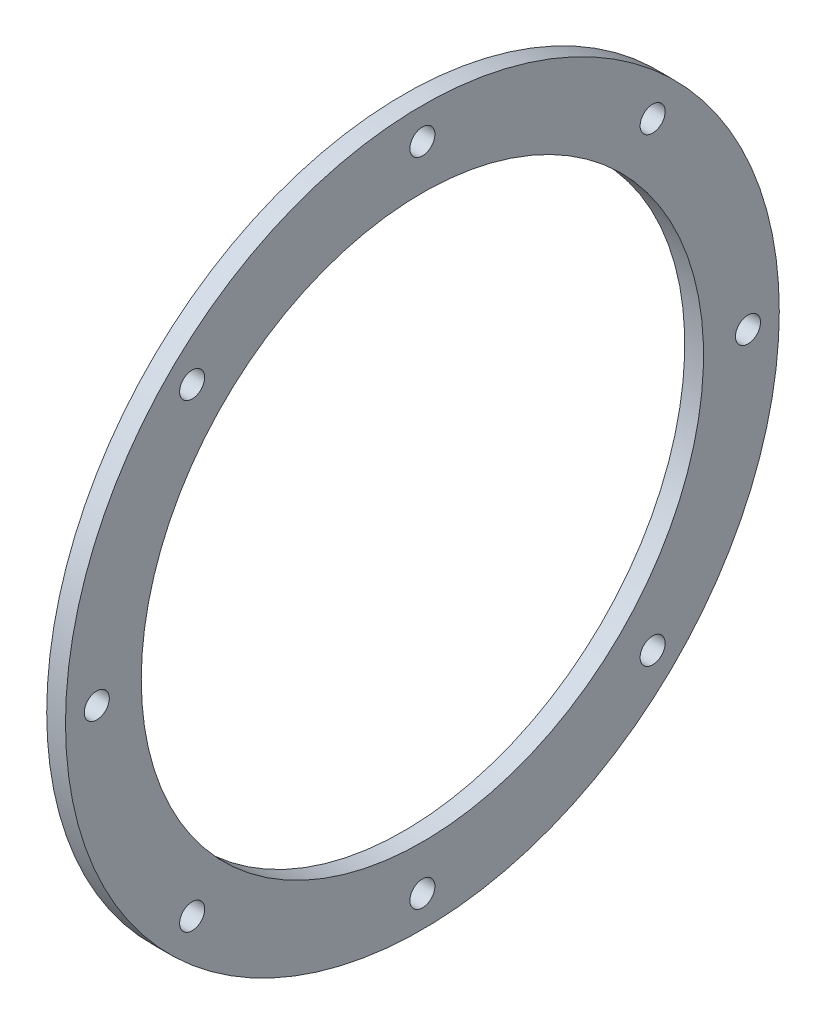
ISO-10303-21;
HEADER;
FILE_DESCRIPTION(('STEP AP214'),'2;1');
FILE_NAME('part.step','',(''),(''),'','','');
FILE_SCHEMA(('AUTOMOTIVE_DESIGN { 1 0 10303 214 1 1 1 1 }'));
ENDSEC;
DATA;
#1=APPLICATION_CONTEXT('core data for automotive mechanical design processes');
#2=APPLICATION_PROTOCOL_DEFINITION('international standard','automotive_design',2000,#1);
#3=PRODUCT_CONTEXT('',#1,'mechanical');
#4=PRODUCT('Part','Part','',(#3));
#5=PRODUCT_RELATED_PRODUCT_CATEGORY('part','',(#4));
#6=PRODUCT_DEFINITION_FORMATION('','',#4);
#7=PRODUCT_DEFINITION_CONTEXT('part definition',#1,'design');
#8=PRODUCT_DEFINITION('design','',#6,#7);
#9=PRODUCT_DEFINITION_SHAPE('','',#8);
#10=(LENGTH_UNIT() NAMED_UNIT(*) SI_UNIT(.MILLI.,.METRE.));
#11=(NAMED_UNIT(*) PLANE_ANGLE_UNIT() SI_UNIT($,.RADIAN.));
#12=(NAMED_UNIT(*) SI_UNIT($,.STERADIAN.) SOLID_ANGLE_UNIT());
#13=UNCERTAINTY_MEASURE_WITH_UNIT(LENGTH_MEASURE(1.E-05),#10,'distance_accuracy_value','');
#14=(GEOMETRIC_REPRESENTATION_CONTEXT(3) GLOBAL_UNCERTAINTY_ASSIGNED_CONTEXT((#13)) GLOBAL_UNIT_ASSIGNED_CONTEXT((#10,
#11,#12)) REPRESENTATION_CONTEXT('',''));
#15=CARTESIAN_POINT('',(0.,0.,0.));
#16=DIRECTION('',(0.,0.,1.));
#17=DIRECTION('',(1.,0.,0.));
#18=AXIS2_PLACEMENT_3D('',#15,#16,#17);
#19=CARTESIAN_POINT('',(12.2498384295794,0.,0.));
#20=DIRECTION('',(1.,0.,0.));
#21=DIRECTION('',(0.,0.,-1.));
#22=AXIS2_PLACEMENT_3D('',#19,#20,#21);
#23=PLANE('',#22);
#24=CARTESIAN_POINT('',(12.2498384295794,-1.81557029619843E-13,-52.));
#25=DIRECTION('',(1.,0.,0.));
#26=DIRECTION('',(0.,-1.,0.));
#27=AXIS2_PLACEMENT_3D('',#24,#25,#26);
#28=CIRCLE('',#27,2.);
#29=CARTESIAN_POINT('',(12.2498384295794,-2.00000000000019,-52.));
#30=VERTEX_POINT('',#29);
#31=EDGE_CURVE('E86',#30,#30,#28,.T.);
#32=ORIENTED_EDGE('',*,*,#31,.F.);
#33=EDGE_LOOP('',(#32));
#34=FACE_BOUND('',#33,.T.);
#35=CARTESIAN_POINT('',(12.2498384295794,-36.7695526217007,-36.7695526217003));
#36=DIRECTION('',(1.,0.,0.));
#37=DIRECTION('',(0.,-0.707106781186544,0.707106781186551));
#38=AXIS2_PLACEMENT_3D('',#35,#36,#37);
#39=CIRCLE('',#38,2.);
#40=CARTESIAN_POINT('',(12.2498384295794,-38.1837661840737,-35.3553390593272));
#41=VERTEX_POINT('',#40);
#42=EDGE_CURVE('E80',#41,#41,#39,.T.);
#43=ORIENTED_EDGE('',*,*,#42,.F.);
#44=EDGE_LOOP('',(#43));
#45=FACE_BOUND('',#44,.T.);
#46=CARTESIAN_POINT('',(12.2498384295794,-52.,0.));
#47=DIRECTION('',(1.,0.,0.));
#48=DIRECTION('',(0.,0.,1.));
#49=AXIS2_PLACEMENT_3D('',#46,#47,#48);
#50=CIRCLE('',#49,2.);
#51=CARTESIAN_POINT('',(12.2498384295794,-52.,2.));
#52=VERTEX_POINT('',#51);
#53=EDGE_CURVE('E72',#52,#52,#50,.T.);
#54=ORIENTED_EDGE('',*,*,#53,.F.);
#55=EDGE_LOOP('',(#54));
#56=FACE_BOUND('',#55,.T.);
#57=CARTESIAN_POINT('',(12.2498384295794,-36.7695526217002,36.7695526217008));
#58=DIRECTION('',(1.,0.,0.));
#59=DIRECTION('',(0.,0.707106781186554,0.707106781186541));
#60=AXIS2_PLACEMENT_3D('',#57,#58,#59);
#61=CIRCLE('',#60,2.);
#62=CARTESIAN_POINT('',(12.2498384295794,-35.355339059327,38.1837661840739));
#63=VERTEX_POINT('',#62);
#64=EDGE_CURVE('E73',#63,#63,#61,.T.);
#65=ORIENTED_EDGE('',*,*,#64,.F.);
#66=EDGE_LOOP('',(#65));
#67=FACE_BOUND('',#66,.T.);
#68=CARTESIAN_POINT('',(12.2498384295794,5.44671088859529E-13,52.));
#69=DIRECTION('',(1.,0.,0.));
#70=DIRECTION('',(0.,1.,0.));
#71=AXIS2_PLACEMENT_3D('',#68,#69,#70);
#72=CIRCLE('',#71,2.);
#73=CARTESIAN_POINT('',(12.2498384295794,2.00000000000055,52.));
#74=VERTEX_POINT('',#73);
#75=EDGE_CURVE('E96',#74,#74,#72,.T.);
#76=ORIENTED_EDGE('',*,*,#75,.F.);
#77=EDGE_LOOP('',(#76));
#78=FACE_BOUND('',#77,.T.);
#79=CARTESIAN_POINT('',(12.2498384295794,36.7695526217009,36.7695526217));
#80=DIRECTION('',(1.,0.,0.));
#81=DIRECTION('',(0.,0.707106781186539,-0.707106781186556));
#82=AXIS2_PLACEMENT_3D('',#79,#80,#81);
#83=CIRCLE('',#82,2.);
#84=CARTESIAN_POINT('',(12.2498384295794,38.183766184074,35.3553390593269));
#85=VERTEX_POINT('',#84);
#86=EDGE_CURVE('E97',#85,#85,#83,.T.);
#87=ORIENTED_EDGE('',*,*,#86,.F.);
#88=EDGE_LOOP('',(#87));
#89=FACE_BOUND('',#88,.T.);
#90=CARTESIAN_POINT('',(12.2498384295794,36.7695526217004,-36.7695526217005));
#91=DIRECTION('',(1.,0.,0.));
#92=DIRECTION('',(0.,-0.707106781186549,-0.707106781186546));
#93=AXIS2_PLACEMENT_3D('',#90,#91,#92);
#94=CIRCLE('',#93,2.);
#95=CARTESIAN_POINT('',(12.2498384295794,35.3553390593273,-38.1837661840736));
#96=VERTEX_POINT('',#95);
#97=EDGE_CURVE('E65',#96,#96,#94,.T.);
#98=ORIENTED_EDGE('',*,*,#97,.F.);
#99=EDGE_LOOP('',(#98));
#100=FACE_BOUND('',#99,.T.);
#101=CARTESIAN_POINT('',(12.2498384295794,52.,0.));
#102=DIRECTION('',(1.,0.,0.));
#103=DIRECTION('',(0.,0.,-1.));
#104=AXIS2_PLACEMENT_3D('',#101,#102,#103);
#105=CIRCLE('',#104,2.);
#106=CARTESIAN_POINT('',(12.2498384295794,52.,-2.));
#107=VERTEX_POINT('',#106);
#108=EDGE_CURVE('E56',#107,#107,#105,.T.);
#109=ORIENTED_EDGE('',*,*,#108,.F.);
#110=EDGE_LOOP('',(#109));
#111=FACE_BOUND('',#110,.T.);
#112=CARTESIAN_POINT('',(12.2498384295793,0.,0.));
#113=DIRECTION('',(-1.,0.,0.));
#114=DIRECTION('',(0.,0.,1.));
#115=AXIS2_PLACEMENT_3D('',#112,#113,#114);
#116=CIRCLE('',#115,44.9);
#117=CARTESIAN_POINT('',(12.2498384295793,0.,44.9));
#118=VERTEX_POINT('',#117);
#119=EDGE_CURVE('E51',#118,#118,#116,.T.);
#120=ORIENTED_EDGE('',*,*,#119,.T.);
#121=EDGE_LOOP('',(#120));
#122=FACE_BOUND('',#121,.T.);
#123=CARTESIAN_POINT('',(12.2498384295793,0.,0.));
#124=DIRECTION('',(-1.,0.,0.));
#125=DIRECTION('',(0.,0.,1.));
#126=AXIS2_PLACEMENT_3D('',#123,#124,#125);
#127=CIRCLE('',#126,57.);
#128=CARTESIAN_POINT('',(12.2498384295793,0.,57.));
#129=VERTEX_POINT('',#128);
#130=EDGE_CURVE('E10',#129,#129,#127,.T.);
#131=ORIENTED_EDGE('',*,*,#130,.F.);
#132=EDGE_LOOP('',(#131));
#133=FACE_BOUND('',#132,.T.);
#134=ADVANCED_FACE('F37',(#34,#45,#56,#67,#78,#89,#100,#111,#122,#133),#23,.T.);
#135=CARTESIAN_POINT('',(-478.111946856672,0.,0.));
#136=DIRECTION('',(-1.,0.,0.));
#137=DIRECTION('',(0.,0.,1.));
#138=AXIS2_PLACEMENT_3D('',#135,#136,#137);
#139=CYLINDRICAL_SURFACE('',#138,57.);
#140=ORIENTED_EDGE('',*,*,#130,.T.);
#141=EDGE_LOOP('',(#140));
#142=FACE_BOUND('',#141,.T.);
#143=CARTESIAN_POINT('',(9.24983842957933,0.,0.));
#144=DIRECTION('',(-1.,0.,0.));
#145=DIRECTION('',(0.,0.,1.));
#146=AXIS2_PLACEMENT_3D('',#143,#144,#145);
#147=CIRCLE('',#146,57.);
#148=CARTESIAN_POINT('',(9.24983842957933,0.,57.));
#149=VERTEX_POINT('',#148);
#150=EDGE_CURVE('E43',#149,#149,#147,.T.);
#151=ORIENTED_EDGE('',*,*,#150,.F.);
#152=EDGE_LOOP('',(#151));
#153=FACE_BOUND('',#152,.T.);
#154=ADVANCED_FACE('F110',(#142,#153),#139,.T.);
#155=CARTESIAN_POINT('',(9.24983842957935,0.,0.));
#156=DIRECTION('',(1.,0.,0.));
#157=DIRECTION('',(0.,0.,-1.));
#158=AXIS2_PLACEMENT_3D('',#155,#156,#157);
#159=PLANE('',#158);
#160=CARTESIAN_POINT('',(9.24983842957935,-1.81557029619843E-13,-52.));
#161=DIRECTION('',(-1.,0.,0.));
#162=DIRECTION('',(0.,1.,0.));
#163=AXIS2_PLACEMENT_3D('',#160,#161,#162);
#164=CIRCLE('',#163,2.);
#165=CARTESIAN_POINT('',(9.24983842957935,1.99999999999982,-52.));
#166=VERTEX_POINT('',#165);
#167=EDGE_CURVE('E68',#166,#166,#164,.T.);
#168=ORIENTED_EDGE('',*,*,#167,.F.);
#169=EDGE_LOOP('',(#168));
#170=FACE_BOUND('',#169,.T.);
#171=CARTESIAN_POINT('',(9.24983842957935,-36.7695526217007,-36.7695526217003));
#172=DIRECTION('',(-1.,0.,0.));
#173=DIRECTION('',(0.,0.707106781186544,-0.707106781186551));
#174=AXIS2_PLACEMENT_3D('',#171,#172,#173);
#175=CIRCLE('',#174,2.);
#176=CARTESIAN_POINT('',(9.24983842957935,-35.3553390593276,-38.1837661840734));
#177=VERTEX_POINT('',#176);
#178=EDGE_CURVE('E83',#177,#177,#175,.T.);
#179=ORIENTED_EDGE('',*,*,#178,.F.);
#180=EDGE_LOOP('',(#179));
#181=FACE_BOUND('',#180,.T.);
#182=CARTESIAN_POINT('',(9.24983842957935,-52.,0.));
#183=DIRECTION('',(-1.,0.,0.));
#184=DIRECTION('',(0.,0.,-1.));
#185=AXIS2_PLACEMENT_3D('',#182,#183,#184);
#186=CIRCLE('',#185,2.);
#187=CARTESIAN_POINT('',(9.24983842957935,-52.,-2.));
#188=VERTEX_POINT('',#187);
#189=EDGE_CURVE('E77',#188,#188,#186,.T.);
#190=ORIENTED_EDGE('',*,*,#189,.F.);
#191=EDGE_LOOP('',(#190));
#192=FACE_BOUND('',#191,.T.);
#193=CARTESIAN_POINT('',(9.24983842957935,-36.7695526217002,36.7695526217008));
#194=DIRECTION('',(-1.,0.,0.));
#195=DIRECTION('',(0.,-0.707106781186554,-0.707106781186541));
#196=AXIS2_PLACEMENT_3D('',#193,#194,#195);
#197=CIRCLE('',#196,2.);
#198=CARTESIAN_POINT('',(9.24983842957935,-38.1837661840733,35.3553390593277));
#199=VERTEX_POINT('',#198);
#200=EDGE_CURVE('E69',#199,#199,#197,.T.);
#201=ORIENTED_EDGE('',*,*,#200,.F.);
#202=EDGE_LOOP('',(#201));
#203=FACE_BOUND('',#202,.T.);
#204=CARTESIAN_POINT('',(9.24983842957935,5.44671088859529E-13,52.));
#205=DIRECTION('',(-1.,0.,0.));
#206=DIRECTION('',(0.,-1.,0.));
#207=AXIS2_PLACEMENT_3D('',#204,#205,#206);
#208=CIRCLE('',#207,2.);
#209=CARTESIAN_POINT('',(9.24983842957935,-1.99999999999946,52.));
#210=VERTEX_POINT('',#209);
#211=EDGE_CURVE('E76',#210,#210,#208,.T.);
#212=ORIENTED_EDGE('',*,*,#211,.F.);
#213=EDGE_LOOP('',(#212));
#214=FACE_BOUND('',#213,.T.);
#215=CARTESIAN_POINT('',(9.24983842957935,36.7695526217009,36.7695526217));
#216=DIRECTION('',(-1.,0.,0.));
#217=DIRECTION('',(0.,-0.707106781186539,0.707106781186556));
#218=AXIS2_PLACEMENT_3D('',#215,#216,#217);
#219=CIRCLE('',#218,2.);
#220=CARTESIAN_POINT('',(9.24983842957935,35.3553390593278,38.1837661840731));
#221=VERTEX_POINT('',#220);
#222=EDGE_CURVE('E93',#221,#221,#219,.T.);
#223=ORIENTED_EDGE('',*,*,#222,.F.);
#224=EDGE_LOOP('',(#223));
#225=FACE_BOUND('',#224,.T.);
#226=CARTESIAN_POINT('',(9.24983842957935,36.7695526217004,-36.7695526217005));
#227=DIRECTION('',(-1.,0.,0.));
#228=DIRECTION('',(0.,0.707106781186549,0.707106781186546));
#229=AXIS2_PLACEMENT_3D('',#226,#227,#228);
#230=CIRCLE('',#229,2.);
#231=CARTESIAN_POINT('',(9.24983842957935,38.1837661840735,-35.3553390593274));
#232=VERTEX_POINT('',#231);
#233=EDGE_CURVE('E62',#232,#232,#230,.T.);
#234=ORIENTED_EDGE('',*,*,#233,.F.);
#235=EDGE_LOOP('',(#234));
#236=FACE_BOUND('',#235,.T.);
#237=CARTESIAN_POINT('',(9.24983842957935,52.,0.));
#238=DIRECTION('',(-1.,0.,0.));
#239=DIRECTION('',(0.,0.,1.));
#240=AXIS2_PLACEMENT_3D('',#237,#238,#239);
#241=CIRCLE('',#240,2.);
#242=CARTESIAN_POINT('',(9.24983842957935,52.,2.));
#243=VERTEX_POINT('',#242);
#244=EDGE_CURVE('E59',#243,#243,#241,.T.);
#245=ORIENTED_EDGE('',*,*,#244,.F.);
#246=EDGE_LOOP('',(#245));
#247=FACE_BOUND('',#246,.T.);
#248=CARTESIAN_POINT('',(9.24983842957933,0.,0.));
#249=DIRECTION('',(-1.,0.,0.));
#250=DIRECTION('',(0.,0.,1.));
#251=AXIS2_PLACEMENT_3D('',#248,#249,#250);
#252=CIRCLE('',#251,44.9);
#253=CARTESIAN_POINT('',(9.24983842957933,0.,44.9));
#254=VERTEX_POINT('',#253);
#255=EDGE_CURVE('E47',#254,#254,#252,.T.);
#256=ORIENTED_EDGE('',*,*,#255,.F.);
#257=EDGE_LOOP('',(#256));
#258=FACE_BOUND('',#257,.T.);
#259=ORIENTED_EDGE('',*,*,#150,.T.);
#260=EDGE_LOOP('',(#259));
#261=FACE_BOUND('',#260,.T.);
#262=ADVANCED_FACE('F125',(#170,#181,#192,#203,#214,#225,#236,#247,#258,#261),#159,.F.);
#263=CARTESIAN_POINT('',(-478.111946856672,0.,0.));
#264=DIRECTION('',(-1.,0.,0.));
#265=DIRECTION('',(0.,0.,1.));
#266=AXIS2_PLACEMENT_3D('',#263,#264,#265);
#267=CYLINDRICAL_SURFACE('',#266,44.9);
#268=ORIENTED_EDGE('',*,*,#119,.F.);
#269=EDGE_LOOP('',(#268));
#270=FACE_BOUND('',#269,.T.);
#271=ORIENTED_EDGE('',*,*,#255,.T.);
#272=EDGE_LOOP('',(#271));
#273=FACE_BOUND('',#272,.T.);
#274=ADVANCED_FACE('F121',(#270,#273),#267,.F.);
#275=CARTESIAN_POINT('',(19.2498384295794,52.,0.));
#276=DIRECTION('',(-1.,0.,0.));
#277=DIRECTION('',(0.,0.,1.));
#278=AXIS2_PLACEMENT_3D('',#275,#276,#277);
#279=CYLINDRICAL_SURFACE('',#278,2.);
#280=ORIENTED_EDGE('',*,*,#108,.T.);
#281=EDGE_LOOP('',(#280));
#282=FACE_BOUND('',#281,.T.);
#283=ORIENTED_EDGE('',*,*,#244,.T.);
#284=EDGE_LOOP('',(#283));
#285=FACE_BOUND('',#284,.T.);
#286=ADVANCED_FACE('F124',(#282,#285),#279,.F.);
#287=CARTESIAN_POINT('',(19.2498384295794,36.7695526217004,-36.7695526217005));
#288=DIRECTION('',(-1.,0.,0.));
#289=DIRECTION('',(0.,0.707106781186549,0.707106781186546));
#290=AXIS2_PLACEMENT_3D('',#287,#288,#289);
#291=CYLINDRICAL_SURFACE('',#290,2.);
#292=ORIENTED_EDGE('',*,*,#97,.T.);
#293=EDGE_LOOP('',(#292));
#294=FACE_BOUND('',#293,.T.);
#295=ORIENTED_EDGE('',*,*,#233,.T.);
#296=EDGE_LOOP('',(#295));
#297=FACE_BOUND('',#296,.T.);
#298=ADVANCED_FACE('F140',(#294,#297),#291,.F.);
#299=CARTESIAN_POINT('',(19.2498384295794,36.7695526217009,36.7695526217));
#300=DIRECTION('',(-1.,0.,0.));
#301=DIRECTION('',(0.,-0.707106781186539,0.707106781186556));
#302=AXIS2_PLACEMENT_3D('',#299,#300,#301);
#303=CYLINDRICAL_SURFACE('',#302,2.);
#304=ORIENTED_EDGE('',*,*,#86,.T.);
#305=EDGE_LOOP('',(#304));
#306=FACE_BOUND('',#305,.T.);
#307=ORIENTED_EDGE('',*,*,#222,.T.);
#308=EDGE_LOOP('',(#307));
#309=FACE_BOUND('',#308,.T.);
#310=ADVANCED_FACE('F144',(#306,#309),#303,.F.);
#311=CARTESIAN_POINT('',(19.2498384295794,5.44671088859529E-13,52.));
#312=DIRECTION('',(-1.,0.,0.));
#313=DIRECTION('',(0.,-1.,0.));
#314=AXIS2_PLACEMENT_3D('',#311,#312,#313);
#315=CYLINDRICAL_SURFACE('',#314,2.);
#316=ORIENTED_EDGE('',*,*,#75,.T.);
#317=EDGE_LOOP('',(#316));
#318=FACE_BOUND('',#317,.T.);
#319=ORIENTED_EDGE('',*,*,#211,.T.);
#320=EDGE_LOOP('',(#319));
#321=FACE_BOUND('',#320,.T.);
#322=ADVANCED_FACE('F105',(#318,#321),#315,.F.);
#323=CARTESIAN_POINT('',(19.2498384295794,-36.7695526217002,36.7695526217008));
#324=DIRECTION('',(-1.,0.,0.));
#325=DIRECTION('',(0.,-0.707106781186554,-0.707106781186541));
#326=AXIS2_PLACEMENT_3D('',#323,#324,#325);
#327=CYLINDRICAL_SURFACE('',#326,2.);
#328=ORIENTED_EDGE('',*,*,#64,.T.);
#329=EDGE_LOOP('',(#328));
#330=FACE_BOUND('',#329,.T.);
#331=ORIENTED_EDGE('',*,*,#200,.T.);
#332=EDGE_LOOP('',(#331));
#333=FACE_BOUND('',#332,.T.);
#334=ADVANCED_FACE('F146',(#330,#333),#327,.F.);
#335=CARTESIAN_POINT('',(19.2498384295794,-52.,0.));
#336=DIRECTION('',(-1.,0.,0.));
#337=DIRECTION('',(0.,0.,-1.));
#338=AXIS2_PLACEMENT_3D('',#335,#336,#337);
#339=CYLINDRICAL_SURFACE('',#338,2.);
#340=ORIENTED_EDGE('',*,*,#53,.T.);
#341=EDGE_LOOP('',(#340));
#342=FACE_BOUND('',#341,.T.);
#343=ORIENTED_EDGE('',*,*,#189,.T.);
#344=EDGE_LOOP('',(#343));
#345=FACE_BOUND('',#344,.T.);
#346=ADVANCED_FACE('F149',(#342,#345),#339,.F.);
#347=CARTESIAN_POINT('',(19.2498384295794,-36.7695526217007,-36.7695526217003));
#348=DIRECTION('',(-1.,0.,0.));
#349=DIRECTION('',(0.,0.707106781186544,-0.707106781186551));
#350=AXIS2_PLACEMENT_3D('',#347,#348,#349);
#351=CYLINDRICAL_SURFACE('',#350,2.);
#352=ORIENTED_EDGE('',*,*,#42,.T.);
#353=EDGE_LOOP('',(#352));
#354=FACE_BOUND('',#353,.T.);
#355=ORIENTED_EDGE('',*,*,#178,.T.);
#356=EDGE_LOOP('',(#355));
#357=FACE_BOUND('',#356,.T.);
#358=ADVANCED_FACE('F153',(#354,#357),#351,.F.);
#359=CARTESIAN_POINT('',(19.2498384295794,-1.81557029619843E-13,-52.));
#360=DIRECTION('',(-1.,0.,0.));
#361=DIRECTION('',(0.,1.,0.));
#362=AXIS2_PLACEMENT_3D('',#359,#360,#361);
#363=CYLINDRICAL_SURFACE('',#362,2.);
#364=ORIENTED_EDGE('',*,*,#31,.T.);
#365=EDGE_LOOP('',(#364));
#366=FACE_BOUND('',#365,.T.);
#367=ORIENTED_EDGE('',*,*,#167,.T.);
#368=EDGE_LOOP('',(#367));
#369=FACE_BOUND('',#368,.T.);
#370=ADVANCED_FACE('F157',(#366,#369),#363,.F.);
#371=CLOSED_SHELL('',(#134,#154,#262,#274,#286,#298,#310,#322,#334,#346,#358,#370));
#372=MANIFOLD_SOLID_BREP('B2',#371);
#373=ADVANCED_BREP_SHAPE_REPRESENTATION('',(#18,#372),#14);
#374=SHAPE_DEFINITION_REPRESENTATION(#9,#373);
ENDSEC;
END-ISO-10303-21;
